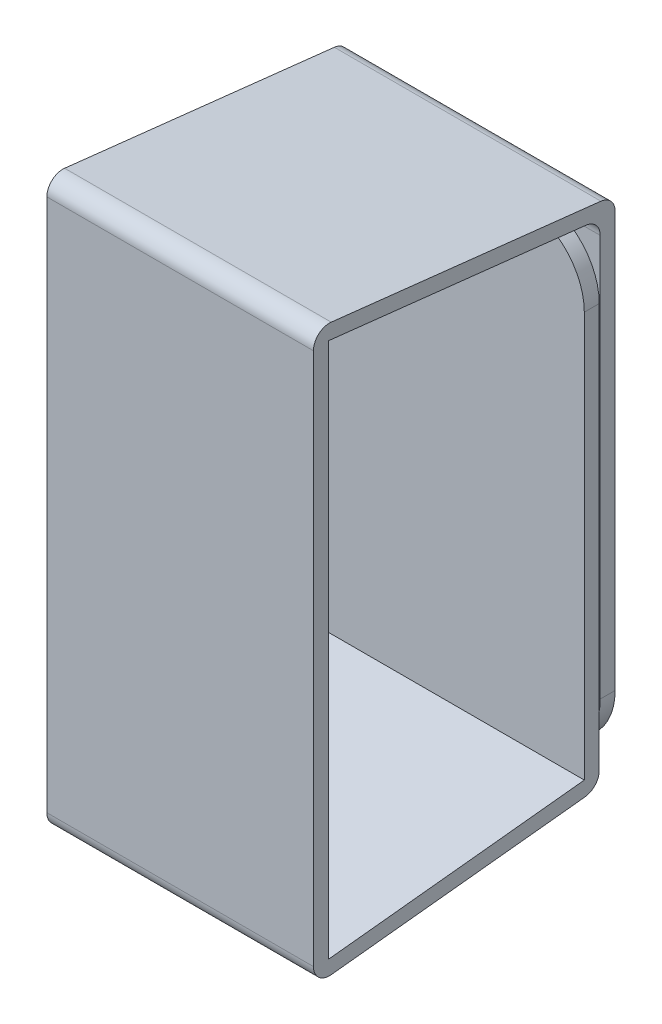
ISO-10303-21;
HEADER;
FILE_DESCRIPTION(('STEP AP214'),'2;1');
FILE_NAME('part.step','',(''),(''),'','','');
FILE_SCHEMA(('AUTOMOTIVE_DESIGN { 1 0 10303 214 1 1 1 1 }'));
ENDSEC;
DATA;
#1=APPLICATION_CONTEXT('core data for automotive mechanical design processes');
#2=APPLICATION_PROTOCOL_DEFINITION('international standard','automotive_design',2000,#1);
#3=PRODUCT_CONTEXT('',#1,'mechanical');
#4=PRODUCT('Part','Part','',(#3));
#5=PRODUCT_RELATED_PRODUCT_CATEGORY('part','',(#4));
#6=PRODUCT_DEFINITION_FORMATION('','',#4);
#7=PRODUCT_DEFINITION_CONTEXT('part definition',#1,'design');
#8=PRODUCT_DEFINITION('design','',#6,#7);
#9=PRODUCT_DEFINITION_SHAPE('','',#8);
#10=(LENGTH_UNIT() NAMED_UNIT(*) SI_UNIT(.MILLI.,.METRE.));
#11=(NAMED_UNIT(*) PLANE_ANGLE_UNIT() SI_UNIT($,.RADIAN.));
#12=(NAMED_UNIT(*) SI_UNIT($,.STERADIAN.) SOLID_ANGLE_UNIT());
#13=UNCERTAINTY_MEASURE_WITH_UNIT(LENGTH_MEASURE(1.E-05),#10,'distance_accuracy_value','');
#14=(GEOMETRIC_REPRESENTATION_CONTEXT(3) GLOBAL_UNCERTAINTY_ASSIGNED_CONTEXT((#13)) GLOBAL_UNIT_ASSIGNED_CONTEXT((#10,
#11,#12)) REPRESENTATION_CONTEXT('',''));
#15=CARTESIAN_POINT('',(0.,0.,0.));
#16=DIRECTION('',(0.,0.,1.));
#17=DIRECTION('',(1.,0.,0.));
#18=AXIS2_PLACEMENT_3D('',#15,#16,#17);
#19=CARTESIAN_POINT('',(6.49999999999956,553.592643475413,-428.248502323548));
#20=DIRECTION('',(0.,0.,1.));
#21=DIRECTION('',(1.,0.,0.));
#22=AXIS2_PLACEMENT_3D('',#19,#20,#21);
#23=CYLINDRICAL_SURFACE('',#22,5.99999999999997);
#24=CARTESIAN_POINT('',(6.49999999999955,553.592643475413,-426.848502323548));
#25=DIRECTION('',(0.,0.,1.));
#26=DIRECTION('',(1.,0.,0.));
#27=AXIS2_PLACEMENT_3D('',#24,#25,#26);
#28=CIRCLE('',#27,5.99999999999997);
#29=CARTESIAN_POINT('',(6.49999999999955,547.592643475413,-426.848502323548));
#30=VERTEX_POINT('',#29);
#31=CARTESIAN_POINT('',(12.4999999999995,553.592643475413,-426.848502323548));
#32=VERTEX_POINT('',#31);
#33=EDGE_CURVE('E271',#30,#32,#28,.T.);
#34=ORIENTED_EDGE('',*,*,#33,.F.);
#35=DIRECTION('',(0.,0.,-1.));
#36=VECTOR('',#35,1.);
#37=CARTESIAN_POINT('',(6.49999999999955,547.592643475413,-428.248502323547));
#38=LINE('',#37,#36);
#39=CARTESIAN_POINT('',(6.49999999999956,547.592643475413,-428.248502323547));
#40=VERTEX_POINT('',#39);
#41=EDGE_CURVE('E212',#40,#30,#38,.F.);
#42=ORIENTED_EDGE('',*,*,#41,.F.);
#43=CARTESIAN_POINT('',(6.49999999999956,553.592643475413,-428.248502323547));
#44=DIRECTION('',(0.,0.,1.));
#45=DIRECTION('',(1.,0.,0.));
#46=AXIS2_PLACEMENT_3D('',#43,#44,#45);
#47=CIRCLE('',#46,5.99999999999997);
#48=CARTESIAN_POINT('',(12.4999999999995,553.592643475413,-428.248502323547));
#49=VERTEX_POINT('',#48);
#50=EDGE_CURVE('E279',#49,#40,#47,.F.);
#51=ORIENTED_EDGE('',*,*,#50,.F.);
#52=DIRECTION('',(0.,0.,1.));
#53=VECTOR('',#52,1.);
#54=CARTESIAN_POINT('',(12.4999999999995,553.592643475413,-428.248502323548));
#55=LINE('',#54,#53);
#56=EDGE_CURVE('E217',#49,#32,#55,.T.);
#57=ORIENTED_EDGE('',*,*,#56,.T.);
#58=EDGE_LOOP('',(#34,#42,#51,#57));
#59=FACE_BOUND('',#58,.T.);
#60=ADVANCED_FACE('F17',(#59),#23,.T.);
#61=CARTESIAN_POINT('',(-6.50000000000047,553.592643475413,-426.848502323548));
#62=DIRECTION('',(0.,0.,-1.));
#63=DIRECTION('',(-1.,0.,0.));
#64=AXIS2_PLACEMENT_3D('',#61,#62,#63);
#65=CYLINDRICAL_SURFACE('',#64,5.99999999999997);
#66=CARTESIAN_POINT('',(-6.50000000000047,553.592643475413,-426.848502323548));
#67=DIRECTION('',(0.,0.,-1.));
#68=DIRECTION('',(-1.,0.,0.));
#69=AXIS2_PLACEMENT_3D('',#66,#67,#68);
#70=CIRCLE('',#69,5.99999999999997);
#71=CARTESIAN_POINT('',(-12.5000000000005,553.592643475413,-426.848502323548));
#72=VERTEX_POINT('',#71);
#73=CARTESIAN_POINT('',(-6.50000000000046,547.592643475413,-426.848502323548));
#74=VERTEX_POINT('',#73);
#75=EDGE_CURVE('E267',#72,#74,#70,.F.);
#76=ORIENTED_EDGE('',*,*,#75,.F.);
#77=DIRECTION('',(0.,0.,-1.));
#78=VECTOR('',#77,1.);
#79=CARTESIAN_POINT('',(-12.5000000000004,553.592643475413,-426.848502323548));
#80=LINE('',#79,#78);
#81=CARTESIAN_POINT('',(-12.5000000000005,553.592643475413,-428.248502323548));
#82=VERTEX_POINT('',#81);
#83=EDGE_CURVE('E215',#72,#82,#80,.T.);
#84=ORIENTED_EDGE('',*,*,#83,.T.);
#85=CARTESIAN_POINT('',(-6.50000000000046,553.592643475413,-428.248502323548));
#86=DIRECTION('',(0.,0.,-1.));
#87=DIRECTION('',(-1.,0.,0.));
#88=AXIS2_PLACEMENT_3D('',#85,#86,#87);
#89=CIRCLE('',#88,5.99999999999997);
#90=CARTESIAN_POINT('',(-6.50000000000046,547.592643475413,-428.248502323547));
#91=VERTEX_POINT('',#90);
#92=EDGE_CURVE('E275',#91,#82,#89,.T.);
#93=ORIENTED_EDGE('',*,*,#92,.F.);
#94=DIRECTION('',(0.,0.,-1.));
#95=VECTOR('',#94,1.);
#96=CARTESIAN_POINT('',(-6.50000000000045,547.592643475413,-428.248502323547));
#97=LINE('',#96,#95);
#98=EDGE_CURVE('E210',#74,#91,#97,.T.);
#99=ORIENTED_EDGE('',*,*,#98,.F.);
#100=EDGE_LOOP('',(#76,#84,#93,#99));
#101=FACE_BOUND('',#100,.T.);
#102=ADVANCED_FACE('F569',(#101),#65,.T.);
#103=CARTESIAN_POINT('',(6.49999999999955,547.592643475413,-428.248502323547));
#104=DIRECTION('',(0.,-1.,0.));
#105=DIRECTION('',(0.,0.,-1.));
#106=AXIS2_PLACEMENT_3D('',#103,#104,#105);
#107=PLANE('',#106);
#108=ORIENTED_EDGE('',*,*,#98,.T.);
#109=DIRECTION('',(-1.,0.,0.));
#110=VECTOR('',#109,1.);
#111=CARTESIAN_POINT('',(12.4999999999995,547.592643475413,-428.248502323547));
#112=LINE('',#111,#110);
#113=EDGE_CURVE('E278',#40,#91,#112,.T.);
#114=ORIENTED_EDGE('',*,*,#113,.F.);
#115=ORIENTED_EDGE('',*,*,#41,.T.);
#116=DIRECTION('',(1.,0.,0.));
#117=VECTOR('',#116,1.);
#118=CARTESIAN_POINT('',(-12.5000000000005,547.592643475413,-426.848502323548));
#119=LINE('',#118,#117);
#120=EDGE_CURVE('E270',#74,#30,#119,.T.);
#121=ORIENTED_EDGE('',*,*,#120,.F.);
#122=EDGE_LOOP('',(#108,#114,#115,#121));
#123=FACE_BOUND('',#122,.T.);
#124=ADVANCED_FACE('F362',(#123),#107,.T.);
#125=CARTESIAN_POINT('',(6.49999999999956,585.758892294611,-425.357743681072));
#126=DIRECTION('',(0.,0.,-1.));
#127=DIRECTION('',(-1.,0.,0.));
#128=AXIS2_PLACEMENT_3D('',#125,#126,#127);
#129=CYLINDRICAL_SURFACE('',#128,5.99999999999996);
#130=CARTESIAN_POINT('',(6.49999999999956,585.758892294611,-425.357743681072));
#131=DIRECTION('',(0.,0.,-1.));
#132=DIRECTION('',(-1.,0.,0.));
#133=AXIS2_PLACEMENT_3D('',#130,#131,#132);
#134=CIRCLE('',#133,5.99999999999996);
#135=CARTESIAN_POINT('',(12.4999999999995,585.758892294611,-425.357743681072));
#136=VERTEX_POINT('',#135);
#137=CARTESIAN_POINT('',(6.49999999999956,591.758892294611,-425.357743681072));
#138=VERTEX_POINT('',#137);
#139=EDGE_CURVE('E264',#136,#138,#134,.F.);
#140=ORIENTED_EDGE('',*,*,#139,.F.);
#141=DIRECTION('',(0.,0.,-1.));
#142=VECTOR('',#141,1.);
#143=CARTESIAN_POINT('',(12.4999999999995,585.758892294611,-425.357743681072));
#144=LINE('',#143,#142);
#145=CARTESIAN_POINT('',(12.4999999999995,585.758892294611,-426.757743681072));
#146=VERTEX_POINT('',#145);
#147=EDGE_CURVE('E162',#136,#146,#144,.T.);
#148=ORIENTED_EDGE('',*,*,#147,.T.);
#149=CARTESIAN_POINT('',(6.49999999999955,585.758892294611,-426.757743681072));
#150=DIRECTION('',(0.,0.,-1.));
#151=DIRECTION('',(-1.,0.,0.));
#152=AXIS2_PLACEMENT_3D('',#149,#150,#151);
#153=CIRCLE('',#152,5.99999999999996);
#154=CARTESIAN_POINT('',(6.49999999999955,591.758892294611,-426.757743681072));
#155=VERTEX_POINT('',#154);
#156=EDGE_CURVE('E20',#155,#146,#153,.T.);
#157=ORIENTED_EDGE('',*,*,#156,.F.);
#158=DIRECTION('',(0.,0.,-1.));
#159=VECTOR('',#158,1.);
#160=CARTESIAN_POINT('',(6.49999999999955,591.758892294611,-426.757743681072));
#161=LINE('',#160,#159);
#162=EDGE_CURVE('E160',#155,#138,#161,.F.);
#163=ORIENTED_EDGE('',*,*,#162,.T.);
#164=EDGE_LOOP('',(#140,#148,#157,#163));
#165=FACE_BOUND('',#164,.T.);
#166=ADVANCED_FACE('F159',(#165),#129,.T.);
#167=CARTESIAN_POINT('',(6.49999999999955,591.758892294611,-426.757743681072));
#168=DIRECTION('',(0.,-1.,0.));
#169=DIRECTION('',(0.,0.,-1.));
#170=AXIS2_PLACEMENT_3D('',#167,#168,#169);
#171=PLANE('',#170);
#172=DIRECTION('',(-1.,0.,0.));
#173=VECTOR('',#172,1.);
#174=CARTESIAN_POINT('',(12.4999999999995,591.758892294611,-426.757743681072));
#175=LINE('',#174,#173);
#176=CARTESIAN_POINT('',(-6.50000000000045,591.758892294611,-426.757743681072));
#177=VERTEX_POINT('',#176);
#178=EDGE_CURVE('E172',#177,#155,#175,.F.);
#179=ORIENTED_EDGE('',*,*,#178,.F.);
#180=DIRECTION('',(0.,0.,1.));
#181=VECTOR('',#180,1.);
#182=CARTESIAN_POINT('',(-6.50000000000045,591.758892294611,-426.757743681072));
#183=LINE('',#182,#181);
#184=CARTESIAN_POINT('',(-6.50000000000045,591.758892294611,-425.357743681072));
#185=VERTEX_POINT('',#184);
#186=EDGE_CURVE('E177',#185,#177,#183,.F.);
#187=ORIENTED_EDGE('',*,*,#186,.F.);
#188=DIRECTION('',(1.,0.,0.));
#189=VECTOR('',#188,1.);
#190=CARTESIAN_POINT('',(-12.5000000000005,591.758892294611,-425.357743681072));
#191=LINE('',#190,#189);
#192=EDGE_CURVE('E175',#138,#185,#191,.F.);
#193=ORIENTED_EDGE('',*,*,#192,.F.);
#194=ORIENTED_EDGE('',*,*,#162,.F.);
#195=EDGE_LOOP('',(#179,#187,#193,#194));
#196=FACE_BOUND('',#195,.T.);
#197=ADVANCED_FACE('F171',(#196),#171,.F.);
#198=CARTESIAN_POINT('',(-6.50000000000046,585.758892294611,-426.757743681072));
#199=DIRECTION('',(0.,0.,1.));
#200=DIRECTION('',(1.,0.,0.));
#201=AXIS2_PLACEMENT_3D('',#198,#199,#200);
#202=CYLINDRICAL_SURFACE('',#201,5.99999999999996);
#203=CARTESIAN_POINT('',(-6.50000000000046,585.758892294611,-426.757743681072));
#204=DIRECTION('',(0.,0.,1.));
#205=DIRECTION('',(1.,0.,0.));
#206=AXIS2_PLACEMENT_3D('',#203,#204,#205);
#207=CIRCLE('',#206,5.99999999999996);
#208=CARTESIAN_POINT('',(-12.5000000000004,585.758892294611,-426.757743681072));
#209=VERTEX_POINT('',#208);
#210=EDGE_CURVE('E167',#209,#177,#207,.F.);
#211=ORIENTED_EDGE('',*,*,#210,.F.);
#212=DIRECTION('',(0.,0.,1.));
#213=VECTOR('',#212,1.);
#214=CARTESIAN_POINT('',(-12.5000000000004,585.758892294611,-426.757743681072));
#215=LINE('',#214,#213);
#216=CARTESIAN_POINT('',(-12.5000000000004,585.758892294611,-425.357743681072));
#217=VERTEX_POINT('',#216);
#218=EDGE_CURVE('E168',#209,#217,#215,.T.);
#219=ORIENTED_EDGE('',*,*,#218,.T.);
#220=CARTESIAN_POINT('',(-6.50000000000046,585.758892294611,-425.357743681072));
#221=DIRECTION('',(0.,0.,1.));
#222=DIRECTION('',(1.,0.,0.));
#223=AXIS2_PLACEMENT_3D('',#220,#221,#222);
#224=CIRCLE('',#223,5.99999999999996);
#225=EDGE_CURVE('E261',#185,#217,#224,.T.);
#226=ORIENTED_EDGE('',*,*,#225,.F.);
#227=ORIENTED_EDGE('',*,*,#186,.T.);
#228=EDGE_LOOP('',(#211,#219,#226,#227));
#229=FACE_BOUND('',#228,.T.);
#230=ADVANCED_FACE('F539',(#229),#202,.T.);
#231=CARTESIAN_POINT('',(12.4999999999995,547.848794961596,-426.757743681072));
#232=DIRECTION('',(0.,0.,-1.));
#233=DIRECTION('',(-1.,0.,0.));
#234=AXIS2_PLACEMENT_3D('',#231,#232,#233);
#235=PLANE('',#234);
#236=ORIENTED_EDGE('',*,*,#210,.T.);
#237=ORIENTED_EDGE('',*,*,#178,.T.);
#238=ORIENTED_EDGE('',*,*,#156,.T.);
#239=DIRECTION('',(0.,1.,0.));
#240=VECTOR('',#239,1.);
#241=CARTESIAN_POINT('',(12.4999999999995,543.810675087512,-426.757743681072));
#242=LINE('',#241,#240);
#243=CARTESIAN_POINT('',(12.4999999999995,547.848794961596,-426.757743681072));
#244=VERTEX_POINT('',#243);
#245=EDGE_CURVE('E192',#244,#146,#242,.T.);
#246=ORIENTED_EDGE('',*,*,#245,.F.);
#247=DIRECTION('',(1.,0.,0.));
#248=VECTOR('',#247,1.);
#249=CARTESIAN_POINT('',(-12.5000000000005,547.848794961596,-426.757743681072));
#250=LINE('',#249,#248);
#251=CARTESIAN_POINT('',(-12.5000000000005,547.848794961596,-426.757743681072));
#252=VERTEX_POINT('',#251);
#253=EDGE_CURVE('E182',#252,#244,#250,.T.);
#254=ORIENTED_EDGE('',*,*,#253,.F.);
#255=DIRECTION('',(0.,-1.,0.));
#256=VECTOR('',#255,1.);
#257=CARTESIAN_POINT('',(-12.5000000000005,543.810675087512,-426.757743681072));
#258=LINE('',#257,#256);
#259=EDGE_CURVE('E240',#209,#252,#258,.T.);
#260=ORIENTED_EDGE('',*,*,#259,.F.);
#261=EDGE_LOOP('',(#236,#237,#238,#246,#254,#260));
#262=FACE_BOUND('',#261,.T.);
#263=ADVANCED_FACE('F179',(#262),#235,.T.);
#264=CARTESIAN_POINT('',(-12.5000000000005,547.848794961596,-425.257743681072));
#265=DIRECTION('',(1.,0.,0.));
#266=DIRECTION('',(0.,1.,0.));
#267=AXIS2_PLACEMENT_3D('',#264,#265,#266);
#268=CYLINDRICAL_SURFACE('',#267,1.50000000000003);
#269=CARTESIAN_POINT('',(-12.5000000000005,547.848794961596,-425.257743681072));
#270=DIRECTION('',(1.,0.,0.));
#271=DIRECTION('',(0.,1.,0.));
#272=AXIS2_PLACEMENT_3D('',#269,#270,#271);
#273=CIRCLE('',#272,1.50000000000003);
#274=CARTESIAN_POINT('',(-12.5000000000005,546.357252547082,-425.416807271212));
#275=VERTEX_POINT('',#274);
#276=EDGE_CURVE('E237',#252,#275,#273,.F.);
#277=ORIENTED_EDGE('',*,*,#276,.F.);
#278=ORIENTED_EDGE('',*,*,#253,.T.);
#279=CARTESIAN_POINT('',(12.4999999999995,547.848794961596,-425.257743681072));
#280=DIRECTION('',(1.,0.,0.));
#281=DIRECTION('',(0.,1.,0.));
#282=AXIS2_PLACEMENT_3D('',#279,#280,#281);
#283=CIRCLE('',#282,1.50000000000003);
#284=CARTESIAN_POINT('',(12.4999999999995,546.357252547082,-425.416807271212));
#285=VERTEX_POINT('',#284);
#286=EDGE_CURVE('E241',#285,#244,#283,.T.);
#287=ORIENTED_EDGE('',*,*,#286,.F.);
#288=DIRECTION('',(1.,0.,0.));
#289=VECTOR('',#288,1.);
#290=CARTESIAN_POINT('',(12.4999999999996,546.357252547082,-425.416807271212));
#291=LINE('',#290,#289);
#292=EDGE_CURVE('E184',#275,#285,#291,.T.);
#293=ORIENTED_EDGE('',*,*,#292,.F.);
#294=EDGE_LOOP('',(#277,#278,#287,#293));
#295=FACE_BOUND('',#294,.T.);
#296=ADVANCED_FACE('F310',(#295),#268,.T.);
#297=CARTESIAN_POINT('',(12.4999999999996,546.357252547082,-425.416807271212));
#298=DIRECTION('',(0.,-0.994361609675499,-0.106042393426173));
#299=DIRECTION('',(0.,0.106042393426173,-0.994361609675499));
#300=AXIS2_PLACEMENT_3D('',#297,#298,#299);
#301=PLANE('',#300);
#302=ORIENTED_EDGE('',*,*,#292,.T.);
#303=DIRECTION('',(0.,0.106042393426159,-0.9943616096755));
#304=VECTOR('',#303,1.);
#305=CARTESIAN_POINT('',(12.4999999999995,543.819132672999,-401.616807271212));
#306=LINE('',#305,#304);
#307=CARTESIAN_POINT('',(12.4999999999995,543.819132672999,-401.616807271212));
#308=VERTEX_POINT('',#307);
#309=EDGE_CURVE('E244',#308,#285,#306,.T.);
#310=ORIENTED_EDGE('',*,*,#309,.F.);
#311=DIRECTION('',(1.,0.,0.));
#312=VECTOR('',#311,1.);
#313=CARTESIAN_POINT('',(-12.5000000000005,543.819132673,-401.616807271212));
#314=LINE('',#313,#312);
#315=CARTESIAN_POINT('',(-12.5000000000005,543.819132672999,-401.616807271212));
#316=VERTEX_POINT('',#315);
#317=EDGE_CURVE('E300',#316,#308,#314,.T.);
#318=ORIENTED_EDGE('',*,*,#317,.F.);
#319=DIRECTION('',(0.,-0.106042393426159,0.9943616096755));
#320=VECTOR('',#319,1.);
#321=CARTESIAN_POINT('',(-12.5000000000005,546.357252547082,-425.416807271212));
#322=LINE('',#321,#320);
#323=EDGE_CURVE('E236',#275,#316,#322,.T.);
#324=ORIENTED_EDGE('',*,*,#323,.F.);
#325=EDGE_LOOP('',(#302,#310,#318,#324));
#326=FACE_BOUND('',#325,.T.);
#327=ADVANCED_FACE('F305',(#326),#301,.T.);
#328=CARTESIAN_POINT('',(-12.5000000000005,545.310675087513,-401.457743681072));
#329=DIRECTION('',(1.,0.,0.));
#330=DIRECTION('',(0.,1.,0.));
#331=AXIS2_PLACEMENT_3D('',#328,#329,#330);
#332=CYLINDRICAL_SURFACE('',#331,1.49999999999994);
#333=CARTESIAN_POINT('',(-12.5000000000005,545.310675087513,-401.457743681072));
#334=DIRECTION('',(1.,0.,0.));
#335=DIRECTION('',(0.,1.,0.));
#336=AXIS2_PLACEMENT_3D('',#333,#334,#335);
#337=CIRCLE('',#336,1.49999999999994);
#338=CARTESIAN_POINT('',(-12.5000000000005,545.310675087513,-399.957743681072));
#339=VERTEX_POINT('',#338);
#340=EDGE_CURVE('E233',#316,#339,#337,.F.);
#341=ORIENTED_EDGE('',*,*,#340,.F.);
#342=ORIENTED_EDGE('',*,*,#317,.T.);
#343=CARTESIAN_POINT('',(12.4999999999995,545.310675087513,-401.457743681072));
#344=DIRECTION('',(1.,0.,0.));
#345=DIRECTION('',(0.,1.,0.));
#346=AXIS2_PLACEMENT_3D('',#343,#344,#345);
#347=CIRCLE('',#346,1.49999999999994);
#348=CARTESIAN_POINT('',(12.4999999999995,545.310675087513,-399.957743681072));
#349=VERTEX_POINT('',#348);
#350=EDGE_CURVE('E245',#349,#308,#347,.T.);
#351=ORIENTED_EDGE('',*,*,#350,.F.);
#352=DIRECTION('',(1.,0.,0.));
#353=VECTOR('',#352,1.);
#354=CARTESIAN_POINT('',(-12.5000000000005,545.310675087512,-399.957743681072));
#355=LINE('',#354,#353);
#356=EDGE_CURVE('E298',#339,#349,#355,.T.);
#357=ORIENTED_EDGE('',*,*,#356,.F.);
#358=EDGE_LOOP('',(#341,#342,#351,#357));
#359=FACE_BOUND('',#358,.T.);
#360=ADVANCED_FACE('F508',(#359),#332,.T.);
#361=CARTESIAN_POINT('',(-12.5000000000005,545.310675087512,-399.957743681072));
#362=DIRECTION('',(0.,0.,1.));
#363=DIRECTION('',(0.,-1.,0.));
#364=AXIS2_PLACEMENT_3D('',#361,#362,#363);
#365=PLANE('',#364);
#366=ORIENTED_EDGE('',*,*,#356,.T.);
#367=DIRECTION('',(0.,1.,0.));
#368=VECTOR('',#367,1.);
#369=CARTESIAN_POINT('',(12.4999999999995,543.810675087512,-399.957743681072));
#370=LINE('',#369,#368);
#371=CARTESIAN_POINT('',(12.4999999999995,595.323591012357,-399.957743681072));
#372=VERTEX_POINT('',#371);
#373=EDGE_CURVE('E248',#372,#349,#370,.F.);
#374=ORIENTED_EDGE('',*,*,#373,.F.);
#375=DIRECTION('',(1.,0.,0.));
#376=VECTOR('',#375,1.);
#377=CARTESIAN_POINT('',(-12.5000000000005,595.323591012357,-399.957743681072));
#378=LINE('',#377,#376);
#379=CARTESIAN_POINT('',(-12.5000000000005,595.323591012357,-399.957743681072));
#380=VERTEX_POINT('',#379);
#381=EDGE_CURVE('E293',#380,#372,#378,.T.);
#382=ORIENTED_EDGE('',*,*,#381,.F.);
#383=DIRECTION('',(0.,-1.,0.));
#384=VECTOR('',#383,1.);
#385=CARTESIAN_POINT('',(-12.5000000000005,543.810675087512,-399.957743681072));
#386=LINE('',#385,#384);
#387=EDGE_CURVE('E232',#339,#380,#386,.F.);
#388=ORIENTED_EDGE('',*,*,#387,.F.);
#389=EDGE_LOOP('',(#366,#374,#382,#388));
#390=FACE_BOUND('',#389,.T.);
#391=ADVANCED_FACE('F499',(#390),#365,.T.);
#392=CARTESIAN_POINT('',(-12.5000000000005,595.323591012357,-401.457743681072));
#393=DIRECTION('',(1.,0.,0.));
#394=DIRECTION('',(0.,0.,-1.));
#395=AXIS2_PLACEMENT_3D('',#392,#393,#394);
#396=CYLINDRICAL_SURFACE('',#395,1.49999999999997);
#397=CARTESIAN_POINT('',(-12.5000000000005,595.323591012357,-401.457743681072));
#398=DIRECTION('',(1.,0.,0.));
#399=DIRECTION('',(0.,0.,-1.));
#400=AXIS2_PLACEMENT_3D('',#397,#398,#399);
#401=CIRCLE('',#400,1.49999999999997);
#402=CARTESIAN_POINT('',(-12.5000000000005,596.814349654833,-401.62399250027));
#403=VERTEX_POINT('',#402);
#404=EDGE_CURVE('E229',#380,#403,#401,.F.);
#405=ORIENTED_EDGE('',*,*,#404,.F.);
#406=ORIENTED_EDGE('',*,*,#381,.T.);
#407=CARTESIAN_POINT('',(12.4999999999995,595.323591012357,-401.457743681072));
#408=DIRECTION('',(1.,0.,0.));
#409=DIRECTION('',(0.,0.,-1.));
#410=AXIS2_PLACEMENT_3D('',#407,#408,#409);
#411=CIRCLE('',#410,1.49999999999997);
#412=CARTESIAN_POINT('',(12.4999999999995,596.814349654832,-401.62399250027));
#413=VERTEX_POINT('',#412);
#414=EDGE_CURVE('E249',#413,#372,#411,.T.);
#415=ORIENTED_EDGE('',*,*,#414,.F.);
#416=DIRECTION('',(1.,0.,0.));
#417=VECTOR('',#416,1.);
#418=CARTESIAN_POINT('',(12.4999999999996,596.814349654832,-401.62399250027));
#419=LINE('',#418,#417);
#420=EDGE_CURVE('E287',#403,#413,#419,.T.);
#421=ORIENTED_EDGE('',*,*,#420,.F.);
#422=EDGE_LOOP('',(#405,#406,#415,#421));
#423=FACE_BOUND('',#422,.T.);
#424=ADVANCED_FACE('F490',(#423),#396,.T.);
#425=CARTESIAN_POINT('',(12.4999999999996,596.814349654832,-401.62399250027));
#426=DIRECTION('',(0.,0.993839094983659,-0.110832546131823));
#427=DIRECTION('',(0.,0.110832546131823,0.993839094983659));
#428=AXIS2_PLACEMENT_3D('',#425,#426,#427);
#429=PLANE('',#428);
#430=DIRECTION('',(1.,0.,0.));
#431=VECTOR('',#430,1.);
#432=CARTESIAN_POINT('',(-12.5000000000005,593.993934168966,-426.914751142745));
#433=LINE('',#432,#431);
#434=CARTESIAN_POINT('',(-12.5000000000005,593.993934168966,-426.914751142745));
#435=VERTEX_POINT('',#434);
#436=CARTESIAN_POINT('',(12.4999999999995,593.993934168966,-426.914751142745));
#437=VERTEX_POINT('',#436);
#438=EDGE_CURVE('E281',#435,#437,#433,.T.);
#439=ORIENTED_EDGE('',*,*,#438,.F.);
#440=DIRECTION('',(0.,-0.110832546131863,-0.993839094983654));
#441=VECTOR('',#440,1.);
#442=CARTESIAN_POINT('',(-12.5000000000004,596.814349654833,-401.62399250027));
#443=LINE('',#442,#441);
#444=EDGE_CURVE('E228',#403,#435,#443,.T.);
#445=ORIENTED_EDGE('',*,*,#444,.F.);
#446=ORIENTED_EDGE('',*,*,#420,.T.);
#447=DIRECTION('',(0.,0.11083254613182,0.993839094983659));
#448=VECTOR('',#447,1.);
#449=CARTESIAN_POINT('',(12.4999999999996,593.993934168966,-426.914751142745));
#450=LINE('',#449,#448);
#451=EDGE_CURVE('E252',#437,#413,#450,.T.);
#452=ORIENTED_EDGE('',*,*,#451,.F.);
#453=EDGE_LOOP('',(#439,#445,#446,#452));
#454=FACE_BOUND('',#453,.T.);
#455=ADVANCED_FACE('F482',(#454),#429,.T.);
#456=CARTESIAN_POINT('',(-12.5000000000005,592.503175526491,-426.748502323547));
#457=DIRECTION('',(1.,0.,0.));
#458=DIRECTION('',(0.,0.,-1.));
#459=AXIS2_PLACEMENT_3D('',#456,#457,#458);
#460=CYLINDRICAL_SURFACE('',#459,1.49999999999991);
#461=CARTESIAN_POINT('',(-12.5000000000005,592.503175526491,-426.748502323547));
#462=DIRECTION('',(1.,0.,0.));
#463=DIRECTION('',(0.,0.,-1.));
#464=AXIS2_PLACEMENT_3D('',#461,#462,#463);
#465=CIRCLE('',#464,1.49999999999991);
#466=CARTESIAN_POINT('',(-12.5000000000005,592.503175526491,-428.248502323547));
#467=VERTEX_POINT('',#466);
#468=EDGE_CURVE('E224',#435,#467,#465,.F.);
#469=ORIENTED_EDGE('',*,*,#468,.F.);
#470=ORIENTED_EDGE('',*,*,#438,.T.);
#471=CARTESIAN_POINT('',(12.4999999999995,592.503175526491,-426.748502323547));
#472=DIRECTION('',(1.,0.,0.));
#473=DIRECTION('',(0.,0.,-1.));
#474=AXIS2_PLACEMENT_3D('',#471,#472,#473);
#475=CIRCLE('',#474,1.49999999999991);
#476=CARTESIAN_POINT('',(12.4999999999995,592.503175526491,-428.248502323547));
#477=VERTEX_POINT('',#476);
#478=EDGE_CURVE('E253',#477,#437,#475,.T.);
#479=ORIENTED_EDGE('',*,*,#478,.F.);
#480=DIRECTION('',(-1.,0.,0.));
#481=VECTOR('',#480,1.);
#482=CARTESIAN_POINT('',(12.4999999999995,592.503175526491,-428.248502323547));
#483=LINE('',#482,#481);
#484=EDGE_CURVE('E274',#467,#477,#483,.F.);
#485=ORIENTED_EDGE('',*,*,#484,.F.);
#486=EDGE_LOOP('',(#469,#470,#479,#485));
#487=FACE_BOUND('',#486,.T.);
#488=ADVANCED_FACE('F474',(#487),#460,.T.);
#489=CARTESIAN_POINT('',(12.4999999999995,547.592643475413,-428.248502323547));
#490=DIRECTION('',(0.,0.,-1.));
#491=DIRECTION('',(-1.,0.,0.));
#492=AXIS2_PLACEMENT_3D('',#489,#490,#491);
#493=PLANE('',#492);
#494=ORIENTED_EDGE('',*,*,#484,.T.);
#495=DIRECTION('',(0.,1.,0.));
#496=VECTOR('',#495,1.);
#497=CARTESIAN_POINT('',(12.4999999999995,543.810675087512,-428.248502323548));
#498=LINE('',#497,#496);
#499=EDGE_CURVE('E256',#49,#477,#498,.T.);
#500=ORIENTED_EDGE('',*,*,#499,.F.);
#501=ORIENTED_EDGE('',*,*,#50,.T.);
#502=ORIENTED_EDGE('',*,*,#113,.T.);
#503=ORIENTED_EDGE('',*,*,#92,.T.);
#504=DIRECTION('',(0.,-1.,0.));
#505=VECTOR('',#504,1.);
#506=CARTESIAN_POINT('',(-12.5000000000005,543.810675087512,-428.248502323548));
#507=LINE('',#506,#505);
#508=EDGE_CURVE('E227',#467,#82,#507,.T.);
#509=ORIENTED_EDGE('',*,*,#508,.F.);
#510=EDGE_LOOP('',(#494,#500,#501,#502,#503,#509));
#511=FACE_BOUND('',#510,.T.);
#512=ADVANCED_FACE('F466',(#511),#493,.T.);
#513=CARTESIAN_POINT('',(-12.5000000000005,547.592643475413,-426.848502323548));
#514=DIRECTION('',(0.,0.,1.));
#515=DIRECTION('',(1.,0.,0.));
#516=AXIS2_PLACEMENT_3D('',#513,#514,#515);
#517=PLANE('',#516);
#518=ORIENTED_EDGE('',*,*,#75,.T.);
#519=ORIENTED_EDGE('',*,*,#120,.T.);
#520=ORIENTED_EDGE('',*,*,#33,.T.);
#521=DIRECTION('',(0.,1.,0.));
#522=VECTOR('',#521,1.);
#523=CARTESIAN_POINT('',(12.4999999999995,543.810675087512,-426.848502323548));
#524=LINE('',#523,#522);
#525=CARTESIAN_POINT('',(12.4999999999995,591.250624241581,-426.848502323548));
#526=VERTEX_POINT('',#525);
#527=EDGE_CURVE('E260',#526,#32,#524,.F.);
#528=ORIENTED_EDGE('',*,*,#527,.F.);
#529=DIRECTION('',(1.,0.,0.));
#530=VECTOR('',#529,1.);
#531=CARTESIAN_POINT('',(-12.5000000000005,591.250624241581,-426.848502323548));
#532=LINE('',#531,#530);
#533=CARTESIAN_POINT('',(-12.5000000000005,591.250624241581,-426.848502323548));
#534=VERTEX_POINT('',#533);
#535=EDGE_CURVE('E266',#526,#534,#532,.F.);
#536=ORIENTED_EDGE('',*,*,#535,.T.);
#537=DIRECTION('',(0.,-1.,0.));
#538=VECTOR('',#537,1.);
#539=CARTESIAN_POINT('',(-12.5000000000005,543.810675087512,-426.848502323548));
#540=LINE('',#539,#538);
#541=EDGE_CURVE('E223',#72,#534,#540,.F.);
#542=ORIENTED_EDGE('',*,*,#541,.F.);
#543=EDGE_LOOP('',(#518,#519,#520,#528,#536,#542));
#544=FACE_BOUND('',#543,.T.);
#545=ADVANCED_FACE('F357',(#544),#517,.T.);
#546=CARTESIAN_POINT('',(-12.5000000000005,591.250624241581,-425.348502323548));
#547=DIRECTION('',(1.,0.,0.));
#548=DIRECTION('',(0.,0.,-1.));
#549=AXIS2_PLACEMENT_3D('',#546,#547,#548);
#550=CYLINDRICAL_SURFACE('',#549,1.4999999999999);
#551=DIRECTION('',(1.,0.,0.));
#552=VECTOR('',#551,1.);
#553=CARTESIAN_POINT('',(12.4999999999996,592.741382884056,-425.514751142745));
#554=LINE('',#553,#552);
#555=CARTESIAN_POINT('',(-12.5000000000005,592.741382884056,-425.514751142745));
#556=VERTEX_POINT('',#555);
#557=CARTESIAN_POINT('',(12.4999999999995,592.741382884056,-425.514751142745));
#558=VERTEX_POINT('',#557);
#559=EDGE_CURVE('E198',#556,#558,#554,.T.);
#560=ORIENTED_EDGE('',*,*,#559,.F.);
#561=CARTESIAN_POINT('',(-12.5000000000005,591.250624241581,-425.348502323548));
#562=DIRECTION('',(1.,0.,0.));
#563=DIRECTION('',(0.,0.,-1.));
#564=AXIS2_PLACEMENT_3D('',#561,#562,#563);
#565=CIRCLE('',#564,1.4999999999999);
#566=EDGE_CURVE('E219',#534,#556,#565,.T.);
#567=ORIENTED_EDGE('',*,*,#566,.F.);
#568=ORIENTED_EDGE('',*,*,#535,.F.);
#569=CARTESIAN_POINT('',(12.4999999999995,591.250624241581,-425.348502323548));
#570=DIRECTION('',(1.,0.,0.));
#571=DIRECTION('',(0.,0.,-1.));
#572=AXIS2_PLACEMENT_3D('',#569,#570,#571);
#573=CIRCLE('',#572,1.4999999999999);
#574=EDGE_CURVE('E257',#558,#526,#573,.F.);
#575=ORIENTED_EDGE('',*,*,#574,.F.);
#576=EDGE_LOOP('',(#560,#567,#568,#575));
#577=FACE_BOUND('',#576,.T.);
#578=ADVANCED_FACE('F370',(#577),#550,.F.);
#579=CARTESIAN_POINT('',(-12.5000000000005,547.758892294611,-425.357743681072));
#580=DIRECTION('',(0.,0.,1.));
#581=DIRECTION('',(1.,0.,0.));
#582=AXIS2_PLACEMENT_3D('',#579,#580,#581);
#583=PLANE('',#582);
#584=DIRECTION('',(1.,0.,0.));
#585=VECTOR('',#584,1.);
#586=CARTESIAN_POINT('',(12.4999999999995,547.758892294611,-425.357743681072));
#587=LINE('',#586,#585);
#588=CARTESIAN_POINT('',(12.4999999999995,547.758892294611,-425.357743681072));
#589=VERTEX_POINT('',#588);
#590=CARTESIAN_POINT('',(-12.5000000000005,547.758892294611,-425.357743681072));
#591=VERTEX_POINT('',#590);
#592=EDGE_CURVE('E191',#589,#591,#587,.F.);
#593=ORIENTED_EDGE('',*,*,#592,.F.);
#594=DIRECTION('',(0.,1.,0.));
#595=VECTOR('',#594,1.);
#596=CARTESIAN_POINT('',(12.4999999999995,543.810675087512,-425.357743681072));
#597=LINE('',#596,#595);
#598=EDGE_CURVE('E195',#136,#589,#597,.F.);
#599=ORIENTED_EDGE('',*,*,#598,.F.);
#600=ORIENTED_EDGE('',*,*,#139,.T.);
#601=ORIENTED_EDGE('',*,*,#192,.T.);
#602=ORIENTED_EDGE('',*,*,#225,.T.);
#603=DIRECTION('',(0.,-1.,0.));
#604=VECTOR('',#603,1.);
#605=CARTESIAN_POINT('',(-12.5000000000005,543.810675087512,-425.357743681072));
#606=LINE('',#605,#604);
#607=EDGE_CURVE('E331',#591,#217,#606,.F.);
#608=ORIENTED_EDGE('',*,*,#607,.F.);
#609=EDGE_LOOP('',(#593,#599,#600,#601,#602,#608));
#610=FACE_BOUND('',#609,.T.);
#611=ADVANCED_FACE('F390',(#610),#583,.T.);
#612=CARTESIAN_POINT('',(12.4999999999996,592.741382884056,-425.514751142745));
#613=DIRECTION('',(0.,-0.993839094983658,0.110832546131827));
#614=DIRECTION('',(0.,-0.110832546131827,-0.993839094983658));
#615=AXIS2_PLACEMENT_3D('',#612,#613,#614);
#616=PLANE('',#615);
#617=DIRECTION('',(1.,0.,0.));
#618=VECTOR('',#617,1.);
#619=CARTESIAN_POINT('',(12.4999999999996,595.435362882848,-401.357743681072));
#620=LINE('',#619,#618);
#621=CARTESIAN_POINT('',(-12.5000000000005,595.435362882848,-401.357743681072));
#622=VERTEX_POINT('',#621);
#623=CARTESIAN_POINT('',(12.4999999999995,595.435362882848,-401.357743681072));
#624=VERTEX_POINT('',#623);
#625=EDGE_CURVE('E204',#622,#624,#620,.T.);
#626=ORIENTED_EDGE('',*,*,#625,.F.);
#627=DIRECTION('',(0.,0.11083254613186,0.993839094983654));
#628=VECTOR('',#627,1.);
#629=CARTESIAN_POINT('',(-12.5000000000004,592.741382884056,-425.514751142745));
#630=LINE('',#629,#628);
#631=EDGE_CURVE('E222',#556,#622,#630,.T.);
#632=ORIENTED_EDGE('',*,*,#631,.F.);
#633=ORIENTED_EDGE('',*,*,#559,.T.);
#634=DIRECTION('',(0.,-0.11083254613186,-0.993839094983654));
#635=VECTOR('',#634,1.);
#636=CARTESIAN_POINT('',(12.4999999999996,595.435362882848,-401.357743681072));
#637=LINE('',#636,#635);
#638=EDGE_CURVE('E197',#624,#558,#637,.T.);
#639=ORIENTED_EDGE('',*,*,#638,.F.);
#640=EDGE_LOOP('',(#626,#632,#633,#639));
#641=FACE_BOUND('',#640,.T.);
#642=ADVANCED_FACE('F397',(#641),#616,.T.);
#643=CARTESIAN_POINT('',(12.4999999999995,543.810675087512,-399.957743681072));
#644=DIRECTION('',(1.,0.,0.));
#645=DIRECTION('',(0.,1.,0.));
#646=AXIS2_PLACEMENT_3D('',#643,#644,#645);
#647=PLANE('',#646);
#648=ORIENTED_EDGE('',*,*,#286,.T.);
#649=ORIENTED_EDGE('',*,*,#245,.T.);
#650=ORIENTED_EDGE('',*,*,#147,.F.);
#651=ORIENTED_EDGE('',*,*,#598,.T.);
#652=DIRECTION('',(0.,-0.106042393426171,0.994361609675499));
#653=VECTOR('',#652,1.);
#654=CARTESIAN_POINT('',(12.4999999999995,545.19944368209,-401.357743681072));
#655=LINE('',#654,#653);
#656=CARTESIAN_POINT('',(12.4999999999995,545.19944368209,-401.357743681072));
#657=VERTEX_POINT('',#656);
#658=EDGE_CURVE('E188',#657,#589,#655,.F.);
#659=ORIENTED_EDGE('',*,*,#658,.F.);
#660=DIRECTION('',(0.,1.,0.));
#661=VECTOR('',#660,1.);
#662=CARTESIAN_POINT('',(12.4999999999995,545.19944368209,-401.357743681072));
#663=LINE('',#662,#661);
#664=EDGE_CURVE('E201',#624,#657,#663,.F.);
#665=ORIENTED_EDGE('',*,*,#664,.F.);
#666=ORIENTED_EDGE('',*,*,#638,.T.);
#667=ORIENTED_EDGE('',*,*,#574,.T.);
#668=ORIENTED_EDGE('',*,*,#527,.T.);
#669=ORIENTED_EDGE('',*,*,#56,.F.);
#670=ORIENTED_EDGE('',*,*,#499,.T.);
#671=ORIENTED_EDGE('',*,*,#478,.T.);
#672=ORIENTED_EDGE('',*,*,#451,.T.);
#673=ORIENTED_EDGE('',*,*,#414,.T.);
#674=ORIENTED_EDGE('',*,*,#373,.T.);
#675=ORIENTED_EDGE('',*,*,#350,.T.);
#676=ORIENTED_EDGE('',*,*,#309,.T.);
#677=EDGE_LOOP('',(#648,#649,#650,#651,#659,#665,#666,#667,#668,#669,#670,#671,#672,#673,#674,
#675,#676));
#678=FACE_BOUND('',#677,.T.);
#679=ADVANCED_FACE('F312',(#678),#647,.T.);
#680=CARTESIAN_POINT('',(12.4999999999995,545.19944368209,-401.357743681072));
#681=DIRECTION('',(0.,0.994361609675499,0.106042393426171));
#682=DIRECTION('',(0.,-0.106042393426171,0.994361609675499));
#683=AXIS2_PLACEMENT_3D('',#680,#681,#682);
#684=PLANE('',#683);
#685=ORIENTED_EDGE('',*,*,#592,.T.);
#686=DIRECTION('',(0.,0.106042393426171,-0.994361609675499));
#687=VECTOR('',#686,1.);
#688=CARTESIAN_POINT('',(-12.5000000000005,545.19944368209,-401.357743681072));
#689=LINE('',#688,#687);
#690=CARTESIAN_POINT('',(-12.5000000000005,545.19944368209,-401.357743681072));
#691=VERTEX_POINT('',#690);
#692=EDGE_CURVE('E35',#691,#591,#689,.T.);
#693=ORIENTED_EDGE('',*,*,#692,.F.);
#694=DIRECTION('',(1.,0.,0.));
#695=VECTOR('',#694,1.);
#696=CARTESIAN_POINT('',(12.4999999999996,545.19944368209,-401.357743681072));
#697=LINE('',#696,#695);
#698=EDGE_CURVE('E26',#657,#691,#697,.F.);
#699=ORIENTED_EDGE('',*,*,#698,.F.);
#700=ORIENTED_EDGE('',*,*,#658,.T.);
#701=EDGE_LOOP('',(#685,#693,#699,#700));
#702=FACE_BOUND('',#701,.T.);
#703=ADVANCED_FACE('F392',(#702),#684,.T.);
#704=CARTESIAN_POINT('',(-12.5000000000005,543.810675087512,-428.248502323548));
#705=DIRECTION('',(-1.,0.,0.));
#706=DIRECTION('',(0.,-1.,0.));
#707=AXIS2_PLACEMENT_3D('',#704,#705,#706);
#708=PLANE('',#707);
#709=ORIENTED_EDGE('',*,*,#692,.T.);
#710=ORIENTED_EDGE('',*,*,#607,.T.);
#711=ORIENTED_EDGE('',*,*,#218,.F.);
#712=ORIENTED_EDGE('',*,*,#259,.T.);
#713=ORIENTED_EDGE('',*,*,#276,.T.);
#714=ORIENTED_EDGE('',*,*,#323,.T.);
#715=ORIENTED_EDGE('',*,*,#340,.T.);
#716=ORIENTED_EDGE('',*,*,#387,.T.);
#717=ORIENTED_EDGE('',*,*,#404,.T.);
#718=ORIENTED_EDGE('',*,*,#444,.T.);
#719=ORIENTED_EDGE('',*,*,#468,.T.);
#720=ORIENTED_EDGE('',*,*,#508,.T.);
#721=ORIENTED_EDGE('',*,*,#83,.F.);
#722=ORIENTED_EDGE('',*,*,#541,.T.);
#723=ORIENTED_EDGE('',*,*,#566,.T.);
#724=ORIENTED_EDGE('',*,*,#631,.T.);
#725=DIRECTION('',(0.,1.,0.));
#726=VECTOR('',#725,1.);
#727=CARTESIAN_POINT('',(-12.5000000000005,545.19944368209,-401.357743681072));
#728=LINE('',#727,#726);
#729=EDGE_CURVE('E11',#691,#622,#728,.T.);
#730=ORIENTED_EDGE('',*,*,#729,.F.);
#731=EDGE_LOOP('',(#709,#710,#711,#712,#713,#714,#715,#716,#717,#718,#719,#720,#721,#722,#723,
#724,#730));
#732=FACE_BOUND('',#731,.T.);
#733=ADVANCED_FACE('F374',(#732),#708,.T.);
#734=CARTESIAN_POINT('',(12.4999999999996,545.19944368209,-401.357743681072));
#735=DIRECTION('',(0.,0.,-1.));
#736=DIRECTION('',(0.,1.,0.));
#737=AXIS2_PLACEMENT_3D('',#734,#735,#736);
#738=PLANE('',#737);
#739=ORIENTED_EDGE('',*,*,#698,.T.);
#740=ORIENTED_EDGE('',*,*,#729,.T.);
#741=ORIENTED_EDGE('',*,*,#625,.T.);
#742=ORIENTED_EDGE('',*,*,#664,.T.);
#743=EDGE_LOOP('',(#739,#740,#741,#742));
#744=FACE_BOUND('',#743,.T.);
#745=ADVANCED_FACE('F395',(#744),#738,.T.);
#746=CLOSED_SHELL('',(#60,#102,#124,#166,#197,#230,#263,#296,#327,#360,#391,#424,#455,#488,#512,
#545,#578,#611,#642,#679,#703,#733,#745));
#747=MANIFOLD_SOLID_BREP('B1',#746);
#748=ADVANCED_BREP_SHAPE_REPRESENTATION('',(#18,#747),#14);
#749=SHAPE_DEFINITION_REPRESENTATION(#9,#748);
ENDSEC;
END-ISO-10303-21;
